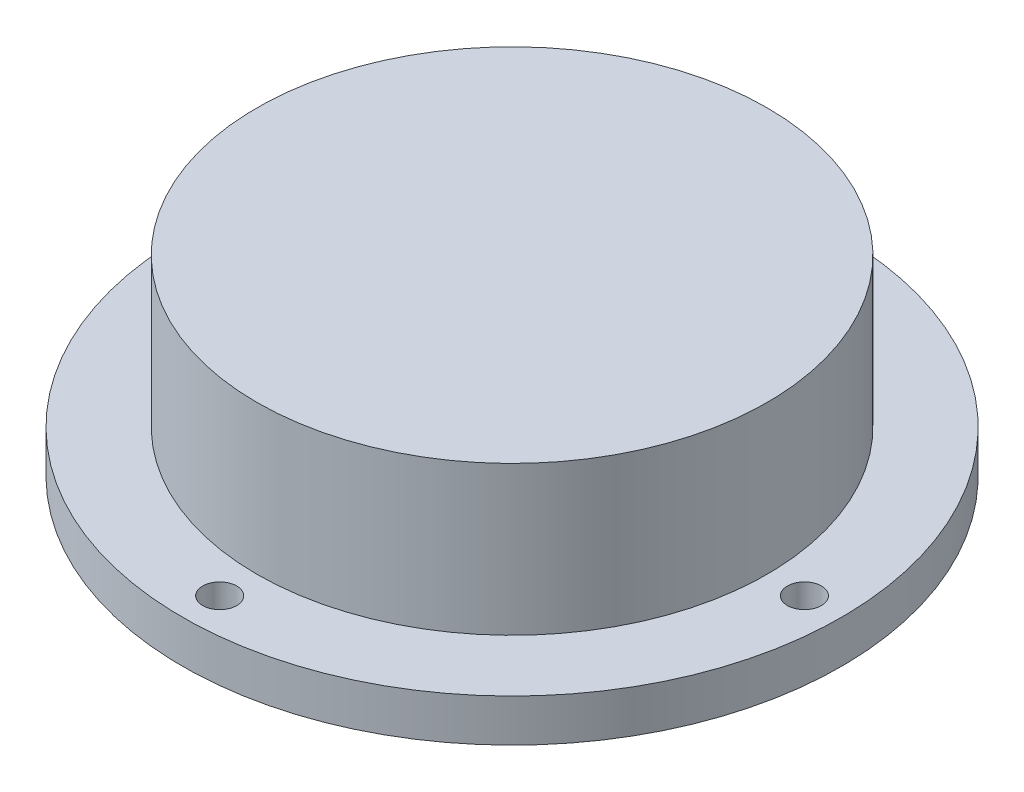
ISO-10303-21;
HEADER;
FILE_DESCRIPTION(('STEP AP214'),'2;1');
FILE_NAME('part.step','',(''),(''),'','','');
FILE_SCHEMA(('AUTOMOTIVE_DESIGN { 1 0 10303 214 1 1 1 1 }'));
ENDSEC;
DATA;
#1=APPLICATION_CONTEXT('core data for automotive mechanical design processes');
#2=APPLICATION_PROTOCOL_DEFINITION('international standard','automotive_design',2000,#1);
#3=PRODUCT_CONTEXT('',#1,'mechanical');
#4=PRODUCT('Part','Part','',(#3));
#5=PRODUCT_RELATED_PRODUCT_CATEGORY('part','',(#4));
#6=PRODUCT_DEFINITION_FORMATION('','',#4);
#7=PRODUCT_DEFINITION_CONTEXT('part definition',#1,'design');
#8=PRODUCT_DEFINITION('design','',#6,#7);
#9=PRODUCT_DEFINITION_SHAPE('','',#8);
#10=(LENGTH_UNIT() NAMED_UNIT(*) SI_UNIT(.MILLI.,.METRE.));
#11=(NAMED_UNIT(*) PLANE_ANGLE_UNIT() SI_UNIT($,.RADIAN.));
#12=(NAMED_UNIT(*) SI_UNIT($,.STERADIAN.) SOLID_ANGLE_UNIT());
#13=UNCERTAINTY_MEASURE_WITH_UNIT(LENGTH_MEASURE(1.E-05),#10,'distance_accuracy_value','');
#14=(GEOMETRIC_REPRESENTATION_CONTEXT(3) GLOBAL_UNCERTAINTY_ASSIGNED_CONTEXT((#13)) GLOBAL_UNIT_ASSIGNED_CONTEXT((#10,
#11,#12)) REPRESENTATION_CONTEXT('',''));
#15=CARTESIAN_POINT('',(0.,0.,0.));
#16=DIRECTION('',(0.,0.,1.));
#17=DIRECTION('',(1.,0.,0.));
#18=AXIS2_PLACEMENT_3D('',#15,#16,#17);
#19=CARTESIAN_POINT('',(0.,10.,0.));
#20=DIRECTION('',(0.,-1.,0.));
#21=DIRECTION('',(0.,0.,-1.));
#22=AXIS2_PLACEMENT_3D('',#19,#20,#21);
#23=CYLINDRICAL_SURFACE('',#22,19.5);
#24=CARTESIAN_POINT('',(0.,10.,0.));
#25=DIRECTION('',(0.,-1.,0.));
#26=DIRECTION('',(0.,0.,-1.));
#27=AXIS2_PLACEMENT_3D('',#24,#25,#26);
#28=CIRCLE('',#27,19.5);
#29=CARTESIAN_POINT('',(0.,10.,-19.5));
#30=VERTEX_POINT('',#29);
#31=EDGE_CURVE('E39',#30,#30,#28,.T.);
#32=ORIENTED_EDGE('',*,*,#31,.F.);
#33=EDGE_LOOP('',(#32));
#34=FACE_BOUND('',#33,.T.);
#35=CARTESIAN_POINT('',(0.,-4.,0.));
#36=DIRECTION('',(0.,-1.,0.));
#37=DIRECTION('',(0.,0.,-1.));
#38=AXIS2_PLACEMENT_3D('',#35,#36,#37);
#39=CIRCLE('',#38,19.5);
#40=CARTESIAN_POINT('',(0.,-4.,-19.5));
#41=VERTEX_POINT('',#40);
#42=EDGE_CURVE('E55',#41,#41,#39,.T.);
#43=ORIENTED_EDGE('',*,*,#42,.T.);
#44=EDGE_LOOP('',(#43));
#45=FACE_BOUND('',#44,.T.);
#46=ADVANCED_FACE('F31',(#34,#45),#23,.F.);
#47=CARTESIAN_POINT('',(0.,10.,0.));
#48=DIRECTION('',(0.,-1.,0.));
#49=DIRECTION('',(0.,0.,-1.));
#50=AXIS2_PLACEMENT_3D('',#47,#48,#49);
#51=PLANE('',#50);
#52=CARTESIAN_POINT('',(0.,10.,0.));
#53=DIRECTION('',(0.,-1.,0.));
#54=DIRECTION('',(0.,0.,-1.));
#55=AXIS2_PLACEMENT_3D('',#52,#53,#54);
#56=CIRCLE('',#55,6.);
#57=CARTESIAN_POINT('',(0.,10.,-6.));
#58=VERTEX_POINT('',#57);
#59=EDGE_CURVE('E46',#58,#58,#56,.T.);
#60=ORIENTED_EDGE('',*,*,#59,.F.);
#61=EDGE_LOOP('',(#60));
#62=FACE_BOUND('',#61,.T.);
#63=ORIENTED_EDGE('',*,*,#31,.T.);
#64=EDGE_LOOP('',(#63));
#65=FACE_BOUND('',#64,.T.);
#66=ADVANCED_FACE('F121',(#62,#65),#51,.T.);
#67=CARTESIAN_POINT('',(0.,11.5,0.));
#68=DIRECTION('',(0.,-1.,0.));
#69=DIRECTION('',(0.,0.,-1.));
#70=AXIS2_PLACEMENT_3D('',#67,#68,#69);
#71=CYLINDRICAL_SURFACE('',#70,6.);
#72=CARTESIAN_POINT('',(0.,11.5,0.));
#73=DIRECTION('',(0.,-1.,0.));
#74=DIRECTION('',(0.,0.,-1.));
#75=AXIS2_PLACEMENT_3D('',#72,#73,#74);
#76=CIRCLE('',#75,6.);
#77=CARTESIAN_POINT('',(0.,11.5,-6.));
#78=VERTEX_POINT('',#77);
#79=EDGE_CURVE('E43',#78,#78,#76,.T.);
#80=ORIENTED_EDGE('',*,*,#79,.F.);
#81=EDGE_LOOP('',(#80));
#82=FACE_BOUND('',#81,.T.);
#83=ORIENTED_EDGE('',*,*,#59,.T.);
#84=EDGE_LOOP('',(#83));
#85=FACE_BOUND('',#84,.T.);
#86=ADVANCED_FACE('F116',(#82,#85),#71,.F.);
#87=CARTESIAN_POINT('',(0.,11.5,0.));
#88=DIRECTION('',(0.,-1.,0.));
#89=DIRECTION('',(0.,0.,-1.));
#90=AXIS2_PLACEMENT_3D('',#87,#88,#89);
#91=PLANE('',#90);
#92=ORIENTED_EDGE('',*,*,#79,.T.);
#93=EDGE_LOOP('',(#92));
#94=FACE_BOUND('',#93,.T.);
#95=ADVANCED_FACE('F106',(#94),#91,.T.);
#96=CARTESIAN_POINT('',(0.,-4.,0.));
#97=DIRECTION('',(0.,1.,0.));
#98=DIRECTION('',(0.,0.,1.));
#99=AXIS2_PLACEMENT_3D('',#96,#97,#98);
#100=CYLINDRICAL_SURFACE('',#99,31.);
#101=CARTESIAN_POINT('',(0.,-4.,0.));
#102=DIRECTION('',(0.,-1.,0.));
#103=DIRECTION('',(0.,0.,-1.));
#104=AXIS2_PLACEMENT_3D('',#101,#102,#103);
#105=CIRCLE('',#104,31.);
#106=CARTESIAN_POINT('',(0.,-4.,-31.));
#107=VERTEX_POINT('',#106);
#108=EDGE_CURVE('E54',#107,#107,#105,.T.);
#109=ORIENTED_EDGE('',*,*,#108,.F.);
#110=EDGE_LOOP('',(#109));
#111=FACE_BOUND('',#110,.T.);
#112=CARTESIAN_POINT('',(0.,0.,0.));
#113=DIRECTION('',(0.,-1.,0.));
#114=DIRECTION('',(0.,0.,-1.));
#115=AXIS2_PLACEMENT_3D('',#112,#113,#114);
#116=CIRCLE('',#115,31.);
#117=CARTESIAN_POINT('',(0.,0.,-31.));
#118=VERTEX_POINT('',#117);
#119=EDGE_CURVE('E51',#118,#118,#116,.T.);
#120=ORIENTED_EDGE('',*,*,#119,.T.);
#121=EDGE_LOOP('',(#120));
#122=FACE_BOUND('',#121,.T.);
#123=ADVANCED_FACE('F104',(#111,#122),#100,.T.);
#124=CARTESIAN_POINT('',(0.,-4.,0.));
#125=DIRECTION('',(0.,-1.,0.));
#126=DIRECTION('',(0.,0.,-1.));
#127=AXIS2_PLACEMENT_3D('',#124,#125,#126);
#128=PLANE('',#127);
#129=CARTESIAN_POINT('',(-27.5,-4.,0.));
#130=DIRECTION('',(0.,1.,0.));
#131=DIRECTION('',(0.,0.,1.));
#132=AXIS2_PLACEMENT_3D('',#129,#130,#131);
#133=CIRCLE('',#132,1.6);
#134=CARTESIAN_POINT('',(-27.5,-4.,1.6));
#135=VERTEX_POINT('',#134);
#136=EDGE_CURVE('E78',#135,#135,#133,.T.);
#137=ORIENTED_EDGE('',*,*,#136,.T.);
#138=EDGE_LOOP('',(#137));
#139=FACE_BOUND('',#138,.T.);
#140=CARTESIAN_POINT('',(0.,-4.,-27.5));
#141=DIRECTION('',(0.,1.,0.));
#142=DIRECTION('',(0.,0.,1.));
#143=AXIS2_PLACEMENT_3D('',#140,#141,#142);
#144=CIRCLE('',#143,1.6);
#145=CARTESIAN_POINT('',(0.,-4.,-25.9));
#146=VERTEX_POINT('',#145);
#147=EDGE_CURVE('E72',#146,#146,#144,.T.);
#148=ORIENTED_EDGE('',*,*,#147,.T.);
#149=EDGE_LOOP('',(#148));
#150=FACE_BOUND('',#149,.T.);
#151=CARTESIAN_POINT('',(27.5,-4.,0.));
#152=DIRECTION('',(0.,1.,0.));
#153=DIRECTION('',(0.,0.,1.));
#154=AXIS2_PLACEMENT_3D('',#151,#152,#153);
#155=CIRCLE('',#154,1.6);
#156=CARTESIAN_POINT('',(27.5,-4.,1.6));
#157=VERTEX_POINT('',#156);
#158=EDGE_CURVE('E66',#157,#157,#155,.T.);
#159=ORIENTED_EDGE('',*,*,#158,.T.);
#160=EDGE_LOOP('',(#159));
#161=FACE_BOUND('',#160,.T.);
#162=CARTESIAN_POINT('',(0.,-4.,27.5));
#163=DIRECTION('',(0.,1.,0.));
#164=DIRECTION('',(0.,0.,1.));
#165=AXIS2_PLACEMENT_3D('',#162,#163,#164);
#166=CIRCLE('',#165,1.6);
#167=CARTESIAN_POINT('',(0.,-4.,29.1));
#168=VERTEX_POINT('',#167);
#169=EDGE_CURVE('E60',#168,#168,#166,.T.);
#170=ORIENTED_EDGE('',*,*,#169,.T.);
#171=EDGE_LOOP('',(#170));
#172=FACE_BOUND('',#171,.T.);
#173=ORIENTED_EDGE('',*,*,#42,.F.);
#174=EDGE_LOOP('',(#173));
#175=FACE_BOUND('',#174,.T.);
#176=ORIENTED_EDGE('',*,*,#108,.T.);
#177=EDGE_LOOP('',(#176));
#178=FACE_BOUND('',#177,.T.);
#179=ADVANCED_FACE('F91',(#139,#150,#161,#172,#175,#178),#128,.T.);
#180=CARTESIAN_POINT('',(0.,0.,0.));
#181=DIRECTION('',(0.,-1.,0.));
#182=DIRECTION('',(0.,0.,-1.));
#183=AXIS2_PLACEMENT_3D('',#180,#181,#182);
#184=PLANE('',#183);
#185=CARTESIAN_POINT('',(-27.5,0.,0.));
#186=DIRECTION('',(0.,1.,0.));
#187=DIRECTION('',(0.,0.,1.));
#188=AXIS2_PLACEMENT_3D('',#185,#186,#187);
#189=CIRCLE('',#188,1.6);
#190=CARTESIAN_POINT('',(-27.5,0.,1.6));
#191=VERTEX_POINT('',#190);
#192=EDGE_CURVE('E81',#191,#191,#189,.T.);
#193=ORIENTED_EDGE('',*,*,#192,.F.);
#194=EDGE_LOOP('',(#193));
#195=FACE_BOUND('',#194,.T.);
#196=CARTESIAN_POINT('',(0.,0.,-27.5));
#197=DIRECTION('',(0.,1.,0.));
#198=DIRECTION('',(0.,0.,1.));
#199=AXIS2_PLACEMENT_3D('',#196,#197,#198);
#200=CIRCLE('',#199,1.6);
#201=CARTESIAN_POINT('',(0.,0.,-25.9));
#202=VERTEX_POINT('',#201);
#203=EDGE_CURVE('E75',#202,#202,#200,.T.);
#204=ORIENTED_EDGE('',*,*,#203,.F.);
#205=EDGE_LOOP('',(#204));
#206=FACE_BOUND('',#205,.T.);
#207=CARTESIAN_POINT('',(27.5,0.,0.));
#208=DIRECTION('',(0.,1.,0.));
#209=DIRECTION('',(0.,0.,1.));
#210=AXIS2_PLACEMENT_3D('',#207,#208,#209);
#211=CIRCLE('',#210,1.6);
#212=CARTESIAN_POINT('',(27.5,0.,1.6));
#213=VERTEX_POINT('',#212);
#214=EDGE_CURVE('E69',#213,#213,#211,.T.);
#215=ORIENTED_EDGE('',*,*,#214,.F.);
#216=EDGE_LOOP('',(#215));
#217=FACE_BOUND('',#216,.T.);
#218=CARTESIAN_POINT('',(0.,0.,27.5));
#219=DIRECTION('',(0.,1.,0.));
#220=DIRECTION('',(0.,0.,1.));
#221=AXIS2_PLACEMENT_3D('',#218,#219,#220);
#222=CIRCLE('',#221,1.6);
#223=CARTESIAN_POINT('',(0.,0.,29.1));
#224=VERTEX_POINT('',#223);
#225=EDGE_CURVE('E63',#224,#224,#222,.T.);
#226=ORIENTED_EDGE('',*,*,#225,.F.);
#227=EDGE_LOOP('',(#226));
#228=FACE_BOUND('',#227,.T.);
#229=CARTESIAN_POINT('',(0.,0.,0.));
#230=DIRECTION('',(0.,1.,0.));
#231=DIRECTION('',(0.,0.,1.));
#232=AXIS2_PLACEMENT_3D('',#229,#230,#231);
#233=CIRCLE('',#232,24.);
#234=CARTESIAN_POINT('',(0.,0.,24.));
#235=VERTEX_POINT('',#234);
#236=EDGE_CURVE('E35',#235,#235,#233,.T.);
#237=ORIENTED_EDGE('',*,*,#236,.F.);
#238=EDGE_LOOP('',(#237));
#239=FACE_BOUND('',#238,.T.);
#240=ORIENTED_EDGE('',*,*,#119,.F.);
#241=EDGE_LOOP('',(#240));
#242=FACE_BOUND('',#241,.T.);
#243=ADVANCED_FACE('F87',(#195,#206,#217,#228,#239,#242),#184,.F.);
#244=CARTESIAN_POINT('',(0.,14.,0.));
#245=DIRECTION('',(0.,1.,0.));
#246=DIRECTION('',(0.,0.,1.));
#247=AXIS2_PLACEMENT_3D('',#244,#245,#246);
#248=PLANE('',#247);
#249=CARTESIAN_POINT('',(0.,14.,0.));
#250=DIRECTION('',(0.,1.,0.));
#251=DIRECTION('',(0.,0.,1.));
#252=AXIS2_PLACEMENT_3D('',#249,#250,#251);
#253=CIRCLE('',#252,24.);
#254=CARTESIAN_POINT('',(0.,14.,24.));
#255=VERTEX_POINT('',#254);
#256=EDGE_CURVE('E10',#255,#255,#253,.T.);
#257=ORIENTED_EDGE('',*,*,#256,.T.);
#258=EDGE_LOOP('',(#257));
#259=FACE_BOUND('',#258,.T.);
#260=ADVANCED_FACE('F90',(#259),#248,.T.);
#261=CARTESIAN_POINT('',(0.,14.,0.));
#262=DIRECTION('',(0.,-1.,0.));
#263=DIRECTION('',(0.,0.,-1.));
#264=AXIS2_PLACEMENT_3D('',#261,#262,#263);
#265=CYLINDRICAL_SURFACE('',#264,24.);
#266=ORIENTED_EDGE('',*,*,#256,.F.);
#267=EDGE_LOOP('',(#266));
#268=FACE_BOUND('',#267,.T.);
#269=ORIENTED_EDGE('',*,*,#236,.T.);
#270=EDGE_LOOP('',(#269));
#271=FACE_BOUND('',#270,.T.);
#272=ADVANCED_FACE('F33',(#268,#271),#265,.T.);
#273=CARTESIAN_POINT('',(0.,0.,27.5));
#274=DIRECTION('',(0.,1.,0.));
#275=DIRECTION('',(0.,0.,1.));
#276=AXIS2_PLACEMENT_3D('',#273,#274,#275);
#277=CYLINDRICAL_SURFACE('',#276,1.6);
#278=ORIENTED_EDGE('',*,*,#169,.F.);
#279=EDGE_LOOP('',(#278));
#280=FACE_BOUND('',#279,.T.);
#281=ORIENTED_EDGE('',*,*,#225,.T.);
#282=EDGE_LOOP('',(#281));
#283=FACE_BOUND('',#282,.T.);
#284=ADVANCED_FACE('F137',(#280,#283),#277,.F.);
#285=CARTESIAN_POINT('',(27.5,0.,0.));
#286=DIRECTION('',(0.,1.,0.));
#287=DIRECTION('',(0.,0.,1.));
#288=AXIS2_PLACEMENT_3D('',#285,#286,#287);
#289=CYLINDRICAL_SURFACE('',#288,1.6);
#290=ORIENTED_EDGE('',*,*,#158,.F.);
#291=EDGE_LOOP('',(#290));
#292=FACE_BOUND('',#291,.T.);
#293=ORIENTED_EDGE('',*,*,#214,.T.);
#294=EDGE_LOOP('',(#293));
#295=FACE_BOUND('',#294,.T.);
#296=ADVANCED_FACE('F142',(#292,#295),#289,.F.);
#297=CARTESIAN_POINT('',(0.,0.,-27.5));
#298=DIRECTION('',(0.,1.,0.));
#299=DIRECTION('',(0.,0.,1.));
#300=AXIS2_PLACEMENT_3D('',#297,#298,#299);
#301=CYLINDRICAL_SURFACE('',#300,1.6);
#302=ORIENTED_EDGE('',*,*,#147,.F.);
#303=EDGE_LOOP('',(#302));
#304=FACE_BOUND('',#303,.T.);
#305=ORIENTED_EDGE('',*,*,#203,.T.);
#306=EDGE_LOOP('',(#305));
#307=FACE_BOUND('',#306,.T.);
#308=ADVANCED_FACE('F149',(#304,#307),#301,.F.);
#309=CARTESIAN_POINT('',(-27.5,0.,0.));
#310=DIRECTION('',(0.,1.,0.));
#311=DIRECTION('',(0.,0.,1.));
#312=AXIS2_PLACEMENT_3D('',#309,#310,#311);
#313=CYLINDRICAL_SURFACE('',#312,1.6);
#314=ORIENTED_EDGE('',*,*,#136,.F.);
#315=EDGE_LOOP('',(#314));
#316=FACE_BOUND('',#315,.T.);
#317=ORIENTED_EDGE('',*,*,#192,.T.);
#318=EDGE_LOOP('',(#317));
#319=FACE_BOUND('',#318,.T.);
#320=ADVANCED_FACE('F85',(#316,#319),#313,.F.);
#321=CLOSED_SHELL('',(#46,#66,#86,#95,#123,#179,#243,#260,#272,#284,#296,#308,#320));
#322=MANIFOLD_SOLID_BREP('B2',#321);
#323=ADVANCED_BREP_SHAPE_REPRESENTATION('',(#18,#322),#14);
#324=SHAPE_DEFINITION_REPRESENTATION(#9,#323);
ENDSEC;
END-ISO-10303-21;
